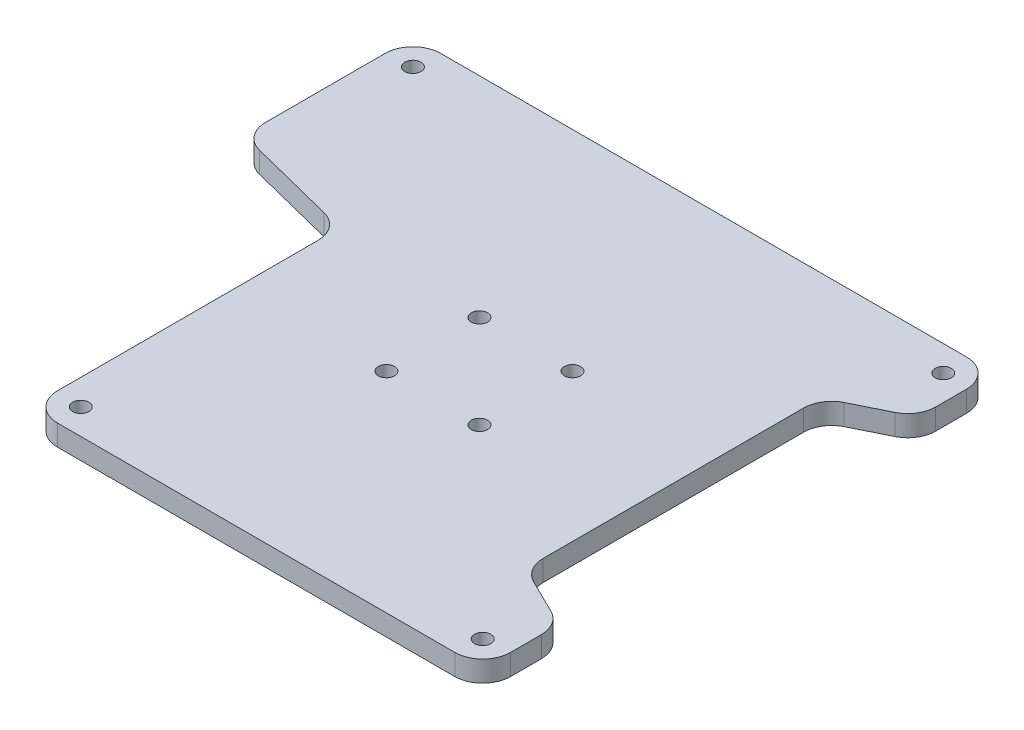
ISO-10303-21;
HEADER;
FILE_DESCRIPTION(('STEP AP214'),'2;1');
FILE_NAME('part.step','',(''),(''),'','','');
FILE_SCHEMA(('AUTOMOTIVE_DESIGN { 1 0 10303 214 1 1 1 1 }'));
ENDSEC;
DATA;
#1=APPLICATION_CONTEXT('core data for automotive mechanical design processes');
#2=APPLICATION_PROTOCOL_DEFINITION('international standard','automotive_design',2000,#1);
#3=PRODUCT_CONTEXT('',#1,'mechanical');
#4=PRODUCT('Part','Part','',(#3));
#5=PRODUCT_RELATED_PRODUCT_CATEGORY('part','',(#4));
#6=PRODUCT_DEFINITION_FORMATION('','',#4);
#7=PRODUCT_DEFINITION_CONTEXT('part definition',#1,'design');
#8=PRODUCT_DEFINITION('design','',#6,#7);
#9=PRODUCT_DEFINITION_SHAPE('','',#8);
#10=(LENGTH_UNIT() NAMED_UNIT(*) SI_UNIT(.MILLI.,.METRE.));
#11=(NAMED_UNIT(*) PLANE_ANGLE_UNIT() SI_UNIT($,.RADIAN.));
#12=(NAMED_UNIT(*) SI_UNIT($,.STERADIAN.) SOLID_ANGLE_UNIT());
#13=UNCERTAINTY_MEASURE_WITH_UNIT(LENGTH_MEASURE(1.E-05),#10,'distance_accuracy_value','');
#14=(GEOMETRIC_REPRESENTATION_CONTEXT(3) GLOBAL_UNCERTAINTY_ASSIGNED_CONTEXT((#13)) GLOBAL_UNIT_ASSIGNED_CONTEXT((#10,
#11,#12)) REPRESENTATION_CONTEXT('',''));
#15=CARTESIAN_POINT('',(0.,0.,0.));
#16=DIRECTION('',(0.,0.,1.));
#17=DIRECTION('',(1.,0.,0.));
#18=AXIS2_PLACEMENT_3D('',#15,#16,#17);
#19=CARTESIAN_POINT('',(-35.7,4.5,49.));
#20=DIRECTION('',(0.,1.,0.));
#21=DIRECTION('',(0.,0.,1.));
#22=AXIS2_PLACEMENT_3D('',#19,#20,#21);
#23=PLANE('',#22);
#24=CARTESIAN_POINT('',(10.,4.5,10.));
#25=DIRECTION('',(0.,1.,0.));
#26=DIRECTION('',(0.,0.,1.));
#27=AXIS2_PLACEMENT_3D('',#24,#25,#26);
#28=CIRCLE('',#27,1.75);
#29=CARTESIAN_POINT('',(10.,4.5,11.75));
#30=VERTEX_POINT('',#29);
#31=EDGE_CURVE('E478',#30,#30,#28,.T.);
#32=ORIENTED_EDGE('',*,*,#31,.F.);
#33=EDGE_LOOP('',(#32));
#34=FACE_BOUND('',#33,.T.);
#35=CARTESIAN_POINT('',(-10.,4.5,-10.));
#36=DIRECTION('',(0.,1.,0.));
#37=DIRECTION('',(0.,0.,1.));
#38=AXIS2_PLACEMENT_3D('',#35,#36,#37);
#39=CIRCLE('',#38,1.75);
#40=CARTESIAN_POINT('',(-10.,4.5,-8.25));
#41=VERTEX_POINT('',#40);
#42=EDGE_CURVE('E494',#41,#41,#39,.T.);
#43=ORIENTED_EDGE('',*,*,#42,.F.);
#44=EDGE_LOOP('',(#43));
#45=FACE_BOUND('',#44,.T.);
#46=CARTESIAN_POINT('',(-63.8,4.5,-49.5));
#47=DIRECTION('',(0.,1.,0.));
#48=DIRECTION('',(0.,0.,1.));
#49=AXIS2_PLACEMENT_3D('',#46,#47,#48);
#50=CIRCLE('',#49,1.75);
#51=CARTESIAN_POINT('',(-63.8,4.5,-47.75));
#52=VERTEX_POINT('',#51);
#53=EDGE_CURVE('E510',#52,#52,#50,.T.);
#54=ORIENTED_EDGE('',*,*,#53,.F.);
#55=EDGE_LOOP('',(#54));
#56=FACE_BOUND('',#55,.T.);
#57=CARTESIAN_POINT('',(-36.2,4.5,49.5));
#58=DIRECTION('',(0.,1.,0.));
#59=DIRECTION('',(0.,0.,1.));
#60=AXIS2_PLACEMENT_3D('',#57,#58,#59);
#61=CIRCLE('',#60,1.75);
#62=CARTESIAN_POINT('',(-36.2,4.5,51.25));
#63=VERTEX_POINT('',#62);
#64=EDGE_CURVE('E220',#63,#63,#61,.T.);
#65=ORIENTED_EDGE('',*,*,#64,.F.);
#66=EDGE_LOOP('',(#65));
#67=FACE_BOUND('',#66,.T.);
#68=CARTESIAN_POINT('',(-35.7,4.5,49.));
#69=DIRECTION('',(0.,1.,0.));
#70=DIRECTION('',(0.,0.,1.));
#71=AXIS2_PLACEMENT_3D('',#68,#69,#70);
#72=CIRCLE('',#71,6.00000000000001);
#73=CARTESIAN_POINT('',(-41.7,4.5,49.));
#74=VERTEX_POINT('',#73);
#75=CARTESIAN_POINT('',(-35.7,4.5,55.));
#76=VERTEX_POINT('',#75);
#77=EDGE_CURVE('E274',#74,#76,#72,.T.);
#78=ORIENTED_EDGE('',*,*,#77,.T.);
#79=DIRECTION('',(1.,0.,0.));
#80=VECTOR('',#79,1.);
#81=CARTESIAN_POINT('',(-35.7,4.5,55.));
#82=LINE('',#81,#80);
#83=CARTESIAN_POINT('',(49.7,4.5,55.));
#84=VERTEX_POINT('',#83);
#85=EDGE_CURVE('E138',#76,#84,#82,.T.);
#86=ORIENTED_EDGE('',*,*,#85,.T.);
#87=CARTESIAN_POINT('',(49.7,4.5,49.));
#88=DIRECTION('',(0.,1.,0.));
#89=DIRECTION('',(0.,0.,1.));
#90=AXIS2_PLACEMENT_3D('',#87,#88,#89);
#91=CIRCLE('',#90,5.99999999999999);
#92=CARTESIAN_POINT('',(55.7,4.5,49.));
#93=VERTEX_POINT('',#92);
#94=EDGE_CURVE('E343',#84,#93,#91,.T.);
#95=ORIENTED_EDGE('',*,*,#94,.T.);
#96=DIRECTION('',(0.,0.,-1.));
#97=VECTOR('',#96,1.);
#98=CARTESIAN_POINT('',(55.7,4.5,49.));
#99=LINE('',#98,#97);
#100=CARTESIAN_POINT('',(55.7,4.5,42.3778187247569));
#101=VERTEX_POINT('',#100);
#102=EDGE_CURVE('E363',#93,#101,#99,.T.);
#103=ORIENTED_EDGE('',*,*,#102,.T.);
#104=CARTESIAN_POINT('',(49.7,4.5,42.3778187247569));
#105=DIRECTION('',(0.,1.,0.));
#106=DIRECTION('',(0.,0.,1.));
#107=AXIS2_PLACEMENT_3D('',#104,#105,#106);
#108=CIRCLE('',#107,6.);
#109=CARTESIAN_POINT('',(52.3606513795788,4.5,37.));
#110=VERTEX_POINT('',#109);
#111=EDGE_CURVE('E359',#101,#110,#108,.T.);
#112=ORIENTED_EDGE('',*,*,#111,.T.);
#113=DIRECTION('',(-0.896303120792812,0.,-0.443441896596461));
#114=VECTOR('',#113,1.);
#115=CARTESIAN_POINT('',(52.3606513795788,4.5,37.));
#116=LINE('',#115,#114);
#117=CARTESIAN_POINT('',(45.0393486204213,4.5,33.3778187247569));
#118=VERTEX_POINT('',#117);
#119=EDGE_CURVE('E362',#110,#118,#116,.T.);
#120=ORIENTED_EDGE('',*,*,#119,.T.);
#121=CARTESIAN_POINT('',(47.7,4.5,28.));
#122=DIRECTION('',(0.,-1.,0.));
#123=DIRECTION('',(0.,0.,-1.));
#124=AXIS2_PLACEMENT_3D('',#121,#122,#123);
#125=CIRCLE('',#124,6.00000000000001);
#126=CARTESIAN_POINT('',(41.7,4.5,28.));
#127=VERTEX_POINT('',#126);
#128=EDGE_CURVE('E367',#118,#127,#125,.T.);
#129=ORIENTED_EDGE('',*,*,#128,.T.);
#130=DIRECTION('',(0.,0.,-1.));
#131=VECTOR('',#130,1.);
#132=CARTESIAN_POINT('',(41.7,4.5,28.));
#133=LINE('',#132,#131);
#134=CARTESIAN_POINT('',(41.7,4.5,-28.));
#135=VERTEX_POINT('',#134);
#136=EDGE_CURVE('E374',#127,#135,#133,.T.);
#137=ORIENTED_EDGE('',*,*,#136,.T.);
#138=CARTESIAN_POINT('',(47.7,4.5,-28.));
#139=DIRECTION('',(0.,-1.,0.));
#140=DIRECTION('',(0.,0.,-1.));
#141=AXIS2_PLACEMENT_3D('',#138,#139,#140);
#142=CIRCLE('',#141,6.);
#143=CARTESIAN_POINT('',(45.0393486204212,4.5,-33.3778187247569));
#144=VERTEX_POINT('',#143);
#145=EDGE_CURVE('E377',#135,#144,#142,.T.);
#146=ORIENTED_EDGE('',*,*,#145,.T.);
#147=DIRECTION('',(0.896303120792812,0.,-0.443441896596461));
#148=VECTOR('',#147,1.);
#149=CARTESIAN_POINT('',(45.0393486204213,4.5,-33.3778187247569));
#150=LINE('',#149,#148);
#151=CARTESIAN_POINT('',(52.3606513795788,4.5,-37.));
#152=VERTEX_POINT('',#151);
#153=EDGE_CURVE('E380',#144,#152,#150,.T.);
#154=ORIENTED_EDGE('',*,*,#153,.T.);
#155=CARTESIAN_POINT('',(49.7,4.5,-42.3778187247569));
#156=DIRECTION('',(0.,1.,0.));
#157=DIRECTION('',(0.,0.,1.));
#158=AXIS2_PLACEMENT_3D('',#155,#156,#157);
#159=CIRCLE('',#158,6.);
#160=CARTESIAN_POINT('',(55.7,4.5,-42.3778187247569));
#161=VERTEX_POINT('',#160);
#162=EDGE_CURVE('E383',#152,#161,#159,.T.);
#163=ORIENTED_EDGE('',*,*,#162,.T.);
#164=DIRECTION('',(0.,0.,-1.));
#165=VECTOR('',#164,1.);
#166=CARTESIAN_POINT('',(55.7,4.5,-42.3778187247569));
#167=LINE('',#166,#165);
#168=CARTESIAN_POINT('',(55.7,4.5,-49.));
#169=VERTEX_POINT('',#168);
#170=EDGE_CURVE('E386',#161,#169,#167,.T.);
#171=ORIENTED_EDGE('',*,*,#170,.T.);
#172=CARTESIAN_POINT('',(49.7,4.5,-49.));
#173=DIRECTION('',(0.,1.,0.));
#174=DIRECTION('',(0.,0.,1.));
#175=AXIS2_PLACEMENT_3D('',#172,#173,#174);
#176=CIRCLE('',#175,6.);
#177=CARTESIAN_POINT('',(49.7,4.5,-55.));
#178=VERTEX_POINT('',#177);
#179=EDGE_CURVE('E389',#169,#178,#176,.T.);
#180=ORIENTED_EDGE('',*,*,#179,.T.);
#181=DIRECTION('',(-1.,0.,0.));
#182=VECTOR('',#181,1.);
#183=CARTESIAN_POINT('',(49.7,4.5,-55.));
#184=LINE('',#183,#182);
#185=CARTESIAN_POINT('',(-63.3,4.5,-55.));
#186=VERTEX_POINT('',#185);
#187=EDGE_CURVE('E392',#178,#186,#184,.T.);
#188=ORIENTED_EDGE('',*,*,#187,.T.);
#189=CARTESIAN_POINT('',(-63.3,4.5,-49.));
#190=DIRECTION('',(0.,1.,0.));
#191=DIRECTION('',(0.,0.,1.));
#192=AXIS2_PLACEMENT_3D('',#189,#190,#191);
#193=CIRCLE('',#192,6.00000000000001);
#194=CARTESIAN_POINT('',(-69.3,4.5,-49.));
#195=VERTEX_POINT('',#194);
#196=EDGE_CURVE('E395',#186,#195,#193,.T.);
#197=ORIENTED_EDGE('',*,*,#196,.T.);
#198=DIRECTION('',(0.,0.,1.));
#199=VECTOR('',#198,1.);
#200=CARTESIAN_POINT('',(-69.3,4.5,-49.));
#201=LINE('',#200,#199);
#202=CARTESIAN_POINT('',(-69.3,4.5,-23.317292810075));
#203=VERTEX_POINT('',#202);
#204=EDGE_CURVE('E398',#195,#203,#201,.T.);
#205=ORIENTED_EDGE('',*,*,#204,.T.);
#206=CARTESIAN_POINT('',(-63.3,4.5,-23.317292810075));
#207=DIRECTION('',(0.,1.,0.));
#208=DIRECTION('',(0.,0.,1.));
#209=AXIS2_PLACEMENT_3D('',#206,#207,#208);
#210=CIRCLE('',#209,6.);
#211=CARTESIAN_POINT('',(-64.7693891117909,4.5,-17.5));
#212=VERTEX_POINT('',#211);
#213=EDGE_CURVE('E193',#203,#212,#210,.T.);
#214=ORIENTED_EDGE('',*,*,#213,.T.);
#215=DIRECTION('',(0.969548801679168,0.,0.244898185298482));
#216=VECTOR('',#215,1.);
#217=CARTESIAN_POINT('',(-64.7693891117909,4.5,-17.5));
#218=LINE('',#217,#216);
#219=CARTESIAN_POINT('',(-46.2306108882091,4.5,-12.817292810075));
#220=VERTEX_POINT('',#219);
#221=EDGE_CURVE('E187',#212,#220,#218,.T.);
#222=ORIENTED_EDGE('',*,*,#221,.T.);
#223=CARTESIAN_POINT('',(-47.7,4.5,-6.99999999999999));
#224=DIRECTION('',(0.,-1.,0.));
#225=DIRECTION('',(0.,0.,-1.));
#226=AXIS2_PLACEMENT_3D('',#223,#224,#225);
#227=CIRCLE('',#226,6.);
#228=CARTESIAN_POINT('',(-41.7,4.5,-6.99999999999999));
#229=VERTEX_POINT('',#228);
#230=EDGE_CURVE('E191',#220,#229,#227,.T.);
#231=ORIENTED_EDGE('',*,*,#230,.T.);
#232=DIRECTION('',(0.,0.,1.));
#233=VECTOR('',#232,1.);
#234=CARTESIAN_POINT('',(-41.7,4.5,-6.99999999999999));
#235=LINE('',#234,#233);
#236=EDGE_CURVE('E59',#229,#74,#235,.T.);
#237=ORIENTED_EDGE('',*,*,#236,.T.);
#238=EDGE_LOOP('',(#78,#86,#95,#103,#112,#120,#129,#137,#146,#154,#163,#171,#180,#188,#197,#205,
#214,#222,#231,#237));
#239=FACE_BOUND('',#238,.T.);
#240=CARTESIAN_POINT('',(50.2,4.5,49.5));
#241=DIRECTION('',(0.,1.,0.));
#242=DIRECTION('',(0.,0.,1.));
#243=AXIS2_PLACEMENT_3D('',#240,#241,#242);
#244=CIRCLE('',#243,1.75);
#245=CARTESIAN_POINT('',(50.2,4.5,51.25));
#246=VERTEX_POINT('',#245);
#247=EDGE_CURVE('E518',#246,#246,#244,.T.);
#248=ORIENTED_EDGE('',*,*,#247,.F.);
#249=EDGE_LOOP('',(#248));
#250=FACE_BOUND('',#249,.T.);
#251=CARTESIAN_POINT('',(50.2,4.5,-49.5));
#252=DIRECTION('',(0.,1.,0.));
#253=DIRECTION('',(0.,0.,1.));
#254=AXIS2_PLACEMENT_3D('',#251,#252,#253);
#255=CIRCLE('',#254,1.75);
#256=CARTESIAN_POINT('',(50.2,4.5,-47.75));
#257=VERTEX_POINT('',#256);
#258=EDGE_CURVE('E502',#257,#257,#255,.T.);
#259=ORIENTED_EDGE('',*,*,#258,.F.);
#260=EDGE_LOOP('',(#259));
#261=FACE_BOUND('',#260,.T.);
#262=CARTESIAN_POINT('',(-10.,4.5,10.));
#263=DIRECTION('',(0.,1.,0.));
#264=DIRECTION('',(0.,0.,1.));
#265=AXIS2_PLACEMENT_3D('',#262,#263,#264);
#266=CIRCLE('',#265,1.75);
#267=CARTESIAN_POINT('',(-10.,4.5,11.75));
#268=VERTEX_POINT('',#267);
#269=EDGE_CURVE('E486',#268,#268,#266,.T.);
#270=ORIENTED_EDGE('',*,*,#269,.F.);
#271=EDGE_LOOP('',(#270));
#272=FACE_BOUND('',#271,.T.);
#273=CARTESIAN_POINT('',(10.,4.5,-10.));
#274=DIRECTION('',(0.,1.,0.));
#275=DIRECTION('',(0.,0.,1.));
#276=AXIS2_PLACEMENT_3D('',#273,#274,#275);
#277=CIRCLE('',#276,1.75);
#278=CARTESIAN_POINT('',(10.,4.5,-8.25));
#279=VERTEX_POINT('',#278);
#280=EDGE_CURVE('E467',#279,#279,#277,.T.);
#281=ORIENTED_EDGE('',*,*,#280,.F.);
#282=EDGE_LOOP('',(#281));
#283=FACE_BOUND('',#282,.T.);
#284=ADVANCED_FACE('F41',(#34,#45,#56,#67,#239,#250,#261,#272,#283),#23,.T.);
#285=CARTESIAN_POINT('',(-35.7,0.,49.));
#286=DIRECTION('',(0.,1.,0.));
#287=DIRECTION('',(0.,0.,1.));
#288=AXIS2_PLACEMENT_3D('',#285,#286,#287);
#289=PLANE('',#288);
#290=CARTESIAN_POINT('',(-35.7,0.,49.));
#291=DIRECTION('',(0.,1.,0.));
#292=DIRECTION('',(0.,0.,1.));
#293=AXIS2_PLACEMENT_3D('',#290,#291,#292);
#294=CIRCLE('',#293,6.00000000000001);
#295=CARTESIAN_POINT('',(-41.7,0.,49.));
#296=VERTEX_POINT('',#295);
#297=CARTESIAN_POINT('',(-35.7,0.,55.));
#298=VERTEX_POINT('',#297);
#299=EDGE_CURVE('E215',#296,#298,#294,.T.);
#300=ORIENTED_EDGE('',*,*,#299,.F.);
#301=DIRECTION('',(0.,0.,1.));
#302=VECTOR('',#301,1.);
#303=CARTESIAN_POINT('',(-41.7,0.,-6.99999999999999));
#304=LINE('',#303,#302);
#305=CARTESIAN_POINT('',(-41.7,0.,-6.99999999999999));
#306=VERTEX_POINT('',#305);
#307=EDGE_CURVE('E130',#306,#296,#304,.T.);
#308=ORIENTED_EDGE('',*,*,#307,.F.);
#309=CARTESIAN_POINT('',(-47.7,0.,-6.99999999999999));
#310=DIRECTION('',(0.,-1.,0.));
#311=DIRECTION('',(0.,0.,-1.));
#312=AXIS2_PLACEMENT_3D('',#309,#310,#311);
#313=CIRCLE('',#312,6.);
#314=CARTESIAN_POINT('',(-46.2306108882091,0.,-12.817292810075));
#315=VERTEX_POINT('',#314);
#316=EDGE_CURVE('E124',#315,#306,#313,.T.);
#317=ORIENTED_EDGE('',*,*,#316,.F.);
#318=DIRECTION('',(0.969548801679168,0.,0.244898185298482));
#319=VECTOR('',#318,1.);
#320=CARTESIAN_POINT('',(-64.7693891117909,0.,-17.5));
#321=LINE('',#320,#319);
#322=CARTESIAN_POINT('',(-64.7693891117909,0.,-17.5));
#323=VERTEX_POINT('',#322);
#324=EDGE_CURVE('E202',#323,#315,#321,.T.);
#325=ORIENTED_EDGE('',*,*,#324,.F.);
#326=CARTESIAN_POINT('',(-63.3,0.,-23.317292810075));
#327=DIRECTION('',(0.,1.,0.));
#328=DIRECTION('',(0.,0.,1.));
#329=AXIS2_PLACEMENT_3D('',#326,#327,#328);
#330=CIRCLE('',#329,6.);
#331=CARTESIAN_POINT('',(-69.3,0.,-23.317292810075));
#332=VERTEX_POINT('',#331);
#333=EDGE_CURVE('E265',#332,#323,#330,.T.);
#334=ORIENTED_EDGE('',*,*,#333,.F.);
#335=DIRECTION('',(0.,0.,1.));
#336=VECTOR('',#335,1.);
#337=CARTESIAN_POINT('',(-69.3,0.,-49.));
#338=LINE('',#337,#336);
#339=CARTESIAN_POINT('',(-69.3,0.,-49.));
#340=VERTEX_POINT('',#339);
#341=EDGE_CURVE('E262',#340,#332,#338,.T.);
#342=ORIENTED_EDGE('',*,*,#341,.F.);
#343=CARTESIAN_POINT('',(-63.3,0.,-49.));
#344=DIRECTION('',(0.,1.,0.));
#345=DIRECTION('',(0.,0.,1.));
#346=AXIS2_PLACEMENT_3D('',#343,#344,#345);
#347=CIRCLE('',#346,6.00000000000001);
#348=CARTESIAN_POINT('',(-63.3,0.,-55.));
#349=VERTEX_POINT('',#348);
#350=EDGE_CURVE('E259',#349,#340,#347,.T.);
#351=ORIENTED_EDGE('',*,*,#350,.F.);
#352=DIRECTION('',(-1.,0.,0.));
#353=VECTOR('',#352,1.);
#354=CARTESIAN_POINT('',(49.7,0.,-55.));
#355=LINE('',#354,#353);
#356=CARTESIAN_POINT('',(49.7,0.,-55.));
#357=VERTEX_POINT('',#356);
#358=EDGE_CURVE('E256',#357,#349,#355,.T.);
#359=ORIENTED_EDGE('',*,*,#358,.F.);
#360=CARTESIAN_POINT('',(49.7,0.,-49.));
#361=DIRECTION('',(0.,1.,0.));
#362=DIRECTION('',(0.,0.,1.));
#363=AXIS2_PLACEMENT_3D('',#360,#361,#362);
#364=CIRCLE('',#363,6.);
#365=CARTESIAN_POINT('',(55.7,0.,-49.));
#366=VERTEX_POINT('',#365);
#367=EDGE_CURVE('E253',#366,#357,#364,.T.);
#368=ORIENTED_EDGE('',*,*,#367,.F.);
#369=DIRECTION('',(0.,0.,-1.));
#370=VECTOR('',#369,1.);
#371=CARTESIAN_POINT('',(55.7,0.,-42.3778187247569));
#372=LINE('',#371,#370);
#373=CARTESIAN_POINT('',(55.7,0.,-42.3778187247569));
#374=VERTEX_POINT('',#373);
#375=EDGE_CURVE('E250',#374,#366,#372,.T.);
#376=ORIENTED_EDGE('',*,*,#375,.F.);
#377=CARTESIAN_POINT('',(49.7,0.,-42.3778187247569));
#378=DIRECTION('',(0.,1.,0.));
#379=DIRECTION('',(0.,0.,1.));
#380=AXIS2_PLACEMENT_3D('',#377,#378,#379);
#381=CIRCLE('',#380,6.);
#382=CARTESIAN_POINT('',(52.3606513795788,0.,-37.));
#383=VERTEX_POINT('',#382);
#384=EDGE_CURVE('E247',#383,#374,#381,.T.);
#385=ORIENTED_EDGE('',*,*,#384,.F.);
#386=DIRECTION('',(0.896303120792812,0.,-0.443441896596461));
#387=VECTOR('',#386,1.);
#388=CARTESIAN_POINT('',(45.0393486204213,0.,-33.3778187247569));
#389=LINE('',#388,#387);
#390=CARTESIAN_POINT('',(45.0393486204212,0.,-33.3778187247569));
#391=VERTEX_POINT('',#390);
#392=EDGE_CURVE('E244',#391,#383,#389,.T.);
#393=ORIENTED_EDGE('',*,*,#392,.F.);
#394=CARTESIAN_POINT('',(47.7,0.,-28.));
#395=DIRECTION('',(0.,-1.,0.));
#396=DIRECTION('',(0.,0.,-1.));
#397=AXIS2_PLACEMENT_3D('',#394,#395,#396);
#398=CIRCLE('',#397,6.);
#399=CARTESIAN_POINT('',(41.7,0.,-28.));
#400=VERTEX_POINT('',#399);
#401=EDGE_CURVE('E241',#400,#391,#398,.T.);
#402=ORIENTED_EDGE('',*,*,#401,.F.);
#403=DIRECTION('',(0.,0.,-1.));
#404=VECTOR('',#403,1.);
#405=CARTESIAN_POINT('',(41.7,0.,28.));
#406=LINE('',#405,#404);
#407=CARTESIAN_POINT('',(41.7,0.,28.));
#408=VERTEX_POINT('',#407);
#409=EDGE_CURVE('E238',#408,#400,#406,.T.);
#410=ORIENTED_EDGE('',*,*,#409,.F.);
#411=CARTESIAN_POINT('',(47.7,0.,28.));
#412=DIRECTION('',(0.,-1.,0.));
#413=DIRECTION('',(0.,0.,-1.));
#414=AXIS2_PLACEMENT_3D('',#411,#412,#413);
#415=CIRCLE('',#414,6.00000000000001);
#416=CARTESIAN_POINT('',(45.0393486204213,0.,33.3778187247569));
#417=VERTEX_POINT('',#416);
#418=EDGE_CURVE('E235',#417,#408,#415,.T.);
#419=ORIENTED_EDGE('',*,*,#418,.F.);
#420=DIRECTION('',(-0.896303120792812,0.,-0.443441896596461));
#421=VECTOR('',#420,1.);
#422=CARTESIAN_POINT('',(52.3606513795788,0.,37.));
#423=LINE('',#422,#421);
#424=CARTESIAN_POINT('',(52.3606513795788,0.,37.));
#425=VERTEX_POINT('',#424);
#426=EDGE_CURVE('E232',#425,#417,#423,.T.);
#427=ORIENTED_EDGE('',*,*,#426,.F.);
#428=CARTESIAN_POINT('',(49.7,0.,42.3778187247569));
#429=DIRECTION('',(0.,1.,0.));
#430=DIRECTION('',(0.,0.,1.));
#431=AXIS2_PLACEMENT_3D('',#428,#429,#430);
#432=CIRCLE('',#431,6.);
#433=CARTESIAN_POINT('',(55.7,0.,42.3778187247569));
#434=VERTEX_POINT('',#433);
#435=EDGE_CURVE('E229',#434,#425,#432,.T.);
#436=ORIENTED_EDGE('',*,*,#435,.F.);
#437=DIRECTION('',(0.,0.,-1.));
#438=VECTOR('',#437,1.);
#439=CARTESIAN_POINT('',(55.7,0.,49.));
#440=LINE('',#439,#438);
#441=CARTESIAN_POINT('',(55.7,0.,49.));
#442=VERTEX_POINT('',#441);
#443=EDGE_CURVE('E226',#442,#434,#440,.T.);
#444=ORIENTED_EDGE('',*,*,#443,.F.);
#445=CARTESIAN_POINT('',(49.7,0.,49.));
#446=DIRECTION('',(0.,1.,0.));
#447=DIRECTION('',(0.,0.,1.));
#448=AXIS2_PLACEMENT_3D('',#445,#446,#447);
#449=CIRCLE('',#448,5.99999999999999);
#450=CARTESIAN_POINT('',(49.7,0.,55.));
#451=VERTEX_POINT('',#450);
#452=EDGE_CURVE('E223',#451,#442,#449,.T.);
#453=ORIENTED_EDGE('',*,*,#452,.F.);
#454=DIRECTION('',(1.,0.,0.));
#455=VECTOR('',#454,1.);
#456=CARTESIAN_POINT('',(-35.7,0.,55.));
#457=LINE('',#456,#455);
#458=EDGE_CURVE('E219',#298,#451,#457,.T.);
#459=ORIENTED_EDGE('',*,*,#458,.F.);
#460=EDGE_LOOP('',(#300,#308,#317,#325,#334,#342,#351,#359,#368,#376,#385,#393,#402,#410,#419,
#427,#436,#444,#453,#459));
#461=FACE_BOUND('',#460,.T.);
#462=CARTESIAN_POINT('',(-36.2,0.,49.5));
#463=DIRECTION('',(0.,1.,0.));
#464=DIRECTION('',(0.,0.,1.));
#465=AXIS2_PLACEMENT_3D('',#462,#463,#464);
#466=CIRCLE('',#465,1.75);
#467=CARTESIAN_POINT('',(-36.2,0.,51.25));
#468=VERTEX_POINT('',#467);
#469=EDGE_CURVE('E522',#468,#468,#466,.T.);
#470=ORIENTED_EDGE('',*,*,#469,.T.);
#471=EDGE_LOOP('',(#470));
#472=FACE_BOUND('',#471,.T.);
#473=CARTESIAN_POINT('',(50.2,0.,49.5));
#474=DIRECTION('',(0.,1.,0.));
#475=DIRECTION('',(0.,0.,1.));
#476=AXIS2_PLACEMENT_3D('',#473,#474,#475);
#477=CIRCLE('',#476,1.75);
#478=CARTESIAN_POINT('',(50.2,0.,51.25));
#479=VERTEX_POINT('',#478);
#480=EDGE_CURVE('E514',#479,#479,#477,.T.);
#481=ORIENTED_EDGE('',*,*,#480,.T.);
#482=EDGE_LOOP('',(#481));
#483=FACE_BOUND('',#482,.T.);
#484=CARTESIAN_POINT('',(-63.8,0.,-49.5));
#485=DIRECTION('',(0.,1.,0.));
#486=DIRECTION('',(0.,0.,1.));
#487=AXIS2_PLACEMENT_3D('',#484,#485,#486);
#488=CIRCLE('',#487,1.75);
#489=CARTESIAN_POINT('',(-63.8,0.,-47.75));
#490=VERTEX_POINT('',#489);
#491=EDGE_CURVE('E506',#490,#490,#488,.T.);
#492=ORIENTED_EDGE('',*,*,#491,.T.);
#493=EDGE_LOOP('',(#492));
#494=FACE_BOUND('',#493,.T.);
#495=CARTESIAN_POINT('',(50.2,0.,-49.5));
#496=DIRECTION('',(0.,1.,0.));
#497=DIRECTION('',(0.,0.,1.));
#498=AXIS2_PLACEMENT_3D('',#495,#496,#497);
#499=CIRCLE('',#498,1.75);
#500=CARTESIAN_POINT('',(50.2,0.,-47.75));
#501=VERTEX_POINT('',#500);
#502=EDGE_CURVE('E498',#501,#501,#499,.T.);
#503=ORIENTED_EDGE('',*,*,#502,.T.);
#504=EDGE_LOOP('',(#503));
#505=FACE_BOUND('',#504,.T.);
#506=CARTESIAN_POINT('',(-10.,0.,-10.));
#507=DIRECTION('',(0.,1.,0.));
#508=DIRECTION('',(0.,0.,1.));
#509=AXIS2_PLACEMENT_3D('',#506,#507,#508);
#510=CIRCLE('',#509,1.75);
#511=CARTESIAN_POINT('',(-10.,0.,-8.25));
#512=VERTEX_POINT('',#511);
#513=EDGE_CURVE('E490',#512,#512,#510,.T.);
#514=ORIENTED_EDGE('',*,*,#513,.T.);
#515=EDGE_LOOP('',(#514));
#516=FACE_BOUND('',#515,.T.);
#517=CARTESIAN_POINT('',(-10.,0.,10.));
#518=DIRECTION('',(0.,1.,0.));
#519=DIRECTION('',(0.,0.,1.));
#520=AXIS2_PLACEMENT_3D('',#517,#518,#519);
#521=CIRCLE('',#520,1.75);
#522=CARTESIAN_POINT('',(-10.,0.,11.75));
#523=VERTEX_POINT('',#522);
#524=EDGE_CURVE('E482',#523,#523,#521,.T.);
#525=ORIENTED_EDGE('',*,*,#524,.T.);
#526=EDGE_LOOP('',(#525));
#527=FACE_BOUND('',#526,.T.);
#528=CARTESIAN_POINT('',(10.,0.,10.));
#529=DIRECTION('',(0.,1.,0.));
#530=DIRECTION('',(0.,0.,1.));
#531=AXIS2_PLACEMENT_3D('',#528,#529,#530);
#532=CIRCLE('',#531,1.75);
#533=CARTESIAN_POINT('',(10.,0.,11.75));
#534=VERTEX_POINT('',#533);
#535=EDGE_CURVE('E475',#534,#534,#532,.T.);
#536=ORIENTED_EDGE('',*,*,#535,.T.);
#537=EDGE_LOOP('',(#536));
#538=FACE_BOUND('',#537,.T.);
#539=CARTESIAN_POINT('',(10.,0.,-10.));
#540=DIRECTION('',(0.,1.,0.));
#541=DIRECTION('',(0.,0.,1.));
#542=AXIS2_PLACEMENT_3D('',#539,#540,#541);
#543=CIRCLE('',#542,1.75);
#544=CARTESIAN_POINT('',(10.,0.,-8.25));
#545=VERTEX_POINT('',#544);
#546=EDGE_CURVE('E470',#545,#545,#543,.T.);
#547=ORIENTED_EDGE('',*,*,#546,.T.);
#548=EDGE_LOOP('',(#547));
#549=FACE_BOUND('',#548,.T.);
#550=ADVANCED_FACE('F347',(#461,#472,#483,#494,#505,#516,#527,#538,#549),#289,.F.);
#551=CARTESIAN_POINT('',(-35.7,4.5,49.));
#552=DIRECTION('',(0.,-1.,0.));
#553=DIRECTION('',(0.,0.,-1.));
#554=AXIS2_PLACEMENT_3D('',#551,#552,#553);
#555=CYLINDRICAL_SURFACE('',#554,6.00000000000001);
#556=ORIENTED_EDGE('',*,*,#299,.T.);
#557=DIRECTION('',(0.,-1.,0.));
#558=VECTOR('',#557,1.);
#559=CARTESIAN_POINT('',(-35.7,4.5,55.));
#560=LINE('',#559,#558);
#561=EDGE_CURVE('E11',#76,#298,#560,.T.);
#562=ORIENTED_EDGE('',*,*,#561,.F.);
#563=ORIENTED_EDGE('',*,*,#77,.F.);
#564=DIRECTION('',(0.,-1.,0.));
#565=VECTOR('',#564,1.);
#566=CARTESIAN_POINT('',(-41.7,4.5,49.));
#567=LINE('',#566,#565);
#568=EDGE_CURVE('E211',#74,#296,#567,.T.);
#569=ORIENTED_EDGE('',*,*,#568,.T.);
#570=EDGE_LOOP('',(#556,#562,#563,#569));
#571=FACE_BOUND('',#570,.T.);
#572=ADVANCED_FACE('F43',(#571),#555,.T.);
#573=CARTESIAN_POINT('',(-35.7,4.5,55.));
#574=DIRECTION('',(0.,0.,-1.));
#575=DIRECTION('',(-1.,0.,0.));
#576=AXIS2_PLACEMENT_3D('',#573,#574,#575);
#577=PLANE('',#576);
#578=ORIENTED_EDGE('',*,*,#458,.T.);
#579=DIRECTION('',(0.,-1.,0.));
#580=VECTOR('',#579,1.);
#581=CARTESIAN_POINT('',(49.7,4.5,55.));
#582=LINE('',#581,#580);
#583=EDGE_CURVE('E51',#84,#451,#582,.T.);
#584=ORIENTED_EDGE('',*,*,#583,.F.);
#585=ORIENTED_EDGE('',*,*,#85,.F.);
#586=ORIENTED_EDGE('',*,*,#561,.T.);
#587=EDGE_LOOP('',(#578,#584,#585,#586));
#588=FACE_BOUND('',#587,.T.);
#589=ADVANCED_FACE('F754',(#588),#577,.F.);
#590=CARTESIAN_POINT('',(49.7,4.5,49.));
#591=DIRECTION('',(0.,-1.,0.));
#592=DIRECTION('',(0.,0.,-1.));
#593=AXIS2_PLACEMENT_3D('',#590,#591,#592);
#594=CYLINDRICAL_SURFACE('',#593,5.99999999999999);
#595=ORIENTED_EDGE('',*,*,#452,.T.);
#596=DIRECTION('',(0.,-1.,0.));
#597=VECTOR('',#596,1.);
#598=CARTESIAN_POINT('',(55.7,4.5,49.));
#599=LINE('',#598,#597);
#600=EDGE_CURVE('E333',#93,#442,#599,.T.);
#601=ORIENTED_EDGE('',*,*,#600,.F.);
#602=ORIENTED_EDGE('',*,*,#94,.F.);
#603=ORIENTED_EDGE('',*,*,#583,.T.);
#604=EDGE_LOOP('',(#595,#601,#602,#603));
#605=FACE_BOUND('',#604,.T.);
#606=ADVANCED_FACE('F341',(#605),#594,.T.);
#607=CARTESIAN_POINT('',(55.7,4.5,49.));
#608=DIRECTION('',(-1.,0.,0.));
#609=DIRECTION('',(0.,0.,1.));
#610=AXIS2_PLACEMENT_3D('',#607,#608,#609);
#611=PLANE('',#610);
#612=ORIENTED_EDGE('',*,*,#443,.T.);
#613=DIRECTION('',(0.,-1.,0.));
#614=VECTOR('',#613,1.);
#615=CARTESIAN_POINT('',(55.7,4.5,42.3778187247569));
#616=LINE('',#615,#614);
#617=EDGE_CURVE('E329',#101,#434,#616,.T.);
#618=ORIENTED_EDGE('',*,*,#617,.F.);
#619=ORIENTED_EDGE('',*,*,#102,.F.);
#620=ORIENTED_EDGE('',*,*,#600,.T.);
#621=EDGE_LOOP('',(#612,#618,#619,#620));
#622=FACE_BOUND('',#621,.T.);
#623=ADVANCED_FACE('F353',(#622),#611,.F.);
#624=CARTESIAN_POINT('',(49.7,4.5,42.3778187247569));
#625=DIRECTION('',(0.,-1.,0.));
#626=DIRECTION('',(0.,0.,-1.));
#627=AXIS2_PLACEMENT_3D('',#624,#625,#626);
#628=CYLINDRICAL_SURFACE('',#627,6.);
#629=ORIENTED_EDGE('',*,*,#435,.T.);
#630=DIRECTION('',(0.,-1.,0.));
#631=VECTOR('',#630,1.);
#632=CARTESIAN_POINT('',(52.3606513795788,4.5,37.));
#633=LINE('',#632,#631);
#634=EDGE_CURVE('E325',#110,#425,#633,.T.);
#635=ORIENTED_EDGE('',*,*,#634,.F.);
#636=ORIENTED_EDGE('',*,*,#111,.F.);
#637=ORIENTED_EDGE('',*,*,#617,.T.);
#638=EDGE_LOOP('',(#629,#635,#636,#637));
#639=FACE_BOUND('',#638,.T.);
#640=ADVANCED_FACE('F357',(#639),#628,.T.);
#641=CARTESIAN_POINT('',(52.3606513795788,4.5,37.));
#642=DIRECTION('',(-0.443441896596461,0.,0.896303120792812));
#643=DIRECTION('',(0.896303120792812,0.,0.443441896596461));
#644=AXIS2_PLACEMENT_3D('',#641,#642,#643);
#645=PLANE('',#644);
#646=ORIENTED_EDGE('',*,*,#426,.T.);
#647=DIRECTION('',(0.,-1.,0.));
#648=VECTOR('',#647,1.);
#649=CARTESIAN_POINT('',(45.0393486204213,4.5,33.3778187247569));
#650=LINE('',#649,#648);
#651=EDGE_CURVE('E321',#118,#417,#650,.T.);
#652=ORIENTED_EDGE('',*,*,#651,.F.);
#653=ORIENTED_EDGE('',*,*,#119,.F.);
#654=ORIENTED_EDGE('',*,*,#634,.T.);
#655=EDGE_LOOP('',(#646,#652,#653,#654));
#656=FACE_BOUND('',#655,.T.);
#657=ADVANCED_FACE('F719',(#656),#645,.F.);
#658=CARTESIAN_POINT('',(47.7,4.5,28.));
#659=DIRECTION('',(0.,-1.,0.));
#660=DIRECTION('',(0.,0.,-1.));
#661=AXIS2_PLACEMENT_3D('',#658,#659,#660);
#662=CYLINDRICAL_SURFACE('',#661,6.00000000000001);
#663=ORIENTED_EDGE('',*,*,#418,.T.);
#664=DIRECTION('',(0.,-1.,0.));
#665=VECTOR('',#664,1.);
#666=CARTESIAN_POINT('',(41.7,4.5,28.));
#667=LINE('',#666,#665);
#668=EDGE_CURVE('E317',#127,#408,#667,.T.);
#669=ORIENTED_EDGE('',*,*,#668,.F.);
#670=ORIENTED_EDGE('',*,*,#128,.F.);
#671=ORIENTED_EDGE('',*,*,#651,.T.);
#672=EDGE_LOOP('',(#663,#669,#670,#671));
#673=FACE_BOUND('',#672,.T.);
#674=ADVANCED_FACE('F709',(#673),#662,.F.);
#675=CARTESIAN_POINT('',(41.7,4.5,28.));
#676=DIRECTION('',(-1.,0.,0.));
#677=DIRECTION('',(0.,0.,1.));
#678=AXIS2_PLACEMENT_3D('',#675,#676,#677);
#679=PLANE('',#678);
#680=ORIENTED_EDGE('',*,*,#409,.T.);
#681=DIRECTION('',(0.,-1.,0.));
#682=VECTOR('',#681,1.);
#683=CARTESIAN_POINT('',(41.7,4.5,-28.));
#684=LINE('',#683,#682);
#685=EDGE_CURVE('E313',#135,#400,#684,.T.);
#686=ORIENTED_EDGE('',*,*,#685,.F.);
#687=ORIENTED_EDGE('',*,*,#136,.F.);
#688=ORIENTED_EDGE('',*,*,#668,.T.);
#689=EDGE_LOOP('',(#680,#686,#687,#688));
#690=FACE_BOUND('',#689,.T.);
#691=ADVANCED_FACE('F699',(#690),#679,.F.);
#692=CARTESIAN_POINT('',(47.7,4.5,-28.));
#693=DIRECTION('',(0.,-1.,0.));
#694=DIRECTION('',(0.,0.,-1.));
#695=AXIS2_PLACEMENT_3D('',#692,#693,#694);
#696=CYLINDRICAL_SURFACE('',#695,6.);
#697=ORIENTED_EDGE('',*,*,#401,.T.);
#698=DIRECTION('',(0.,-1.,0.));
#699=VECTOR('',#698,1.);
#700=CARTESIAN_POINT('',(45.0393486204212,4.5,-33.3778187247569));
#701=LINE('',#700,#699);
#702=EDGE_CURVE('E309',#144,#391,#701,.T.);
#703=ORIENTED_EDGE('',*,*,#702,.F.);
#704=ORIENTED_EDGE('',*,*,#145,.F.);
#705=ORIENTED_EDGE('',*,*,#685,.T.);
#706=EDGE_LOOP('',(#697,#703,#704,#705));
#707=FACE_BOUND('',#706,.T.);
#708=ADVANCED_FACE('F689',(#707),#696,.F.);
#709=CARTESIAN_POINT('',(45.0393486204213,4.5,-33.3778187247569));
#710=DIRECTION('',(-0.443441896596461,0.,-0.896303120792812));
#711=DIRECTION('',(-0.896303120792812,0.,0.443441896596461));
#712=AXIS2_PLACEMENT_3D('',#709,#710,#711);
#713=PLANE('',#712);
#714=ORIENTED_EDGE('',*,*,#392,.T.);
#715=DIRECTION('',(0.,-1.,0.));
#716=VECTOR('',#715,1.);
#717=CARTESIAN_POINT('',(52.3606513795788,4.5,-37.));
#718=LINE('',#717,#716);
#719=EDGE_CURVE('E305',#152,#383,#718,.T.);
#720=ORIENTED_EDGE('',*,*,#719,.F.);
#721=ORIENTED_EDGE('',*,*,#153,.F.);
#722=ORIENTED_EDGE('',*,*,#702,.T.);
#723=EDGE_LOOP('',(#714,#720,#721,#722));
#724=FACE_BOUND('',#723,.T.);
#725=ADVANCED_FACE('F679',(#724),#713,.F.);
#726=CARTESIAN_POINT('',(49.7,4.5,-42.3778187247569));
#727=DIRECTION('',(0.,-1.,0.));
#728=DIRECTION('',(0.,0.,-1.));
#729=AXIS2_PLACEMENT_3D('',#726,#727,#728);
#730=CYLINDRICAL_SURFACE('',#729,6.);
#731=ORIENTED_EDGE('',*,*,#384,.T.);
#732=DIRECTION('',(0.,-1.,0.));
#733=VECTOR('',#732,1.);
#734=CARTESIAN_POINT('',(55.7,4.5,-42.3778187247569));
#735=LINE('',#734,#733);
#736=EDGE_CURVE('E301',#161,#374,#735,.T.);
#737=ORIENTED_EDGE('',*,*,#736,.F.);
#738=ORIENTED_EDGE('',*,*,#162,.F.);
#739=ORIENTED_EDGE('',*,*,#719,.T.);
#740=EDGE_LOOP('',(#731,#737,#738,#739));
#741=FACE_BOUND('',#740,.T.);
#742=ADVANCED_FACE('F669',(#741),#730,.T.);
#743=CARTESIAN_POINT('',(55.7,4.5,-42.3778187247569));
#744=DIRECTION('',(-1.,0.,0.));
#745=DIRECTION('',(0.,0.,1.));
#746=AXIS2_PLACEMENT_3D('',#743,#744,#745);
#747=PLANE('',#746);
#748=ORIENTED_EDGE('',*,*,#375,.T.);
#749=DIRECTION('',(0.,-1.,0.));
#750=VECTOR('',#749,1.);
#751=CARTESIAN_POINT('',(55.7,4.5,-49.));
#752=LINE('',#751,#750);
#753=EDGE_CURVE('E297',#169,#366,#752,.T.);
#754=ORIENTED_EDGE('',*,*,#753,.F.);
#755=ORIENTED_EDGE('',*,*,#170,.F.);
#756=ORIENTED_EDGE('',*,*,#736,.T.);
#757=EDGE_LOOP('',(#748,#754,#755,#756));
#758=FACE_BOUND('',#757,.T.);
#759=ADVANCED_FACE('F659',(#758),#747,.F.);
#760=CARTESIAN_POINT('',(49.7,4.5,-49.));
#761=DIRECTION('',(0.,-1.,0.));
#762=DIRECTION('',(0.,0.,-1.));
#763=AXIS2_PLACEMENT_3D('',#760,#761,#762);
#764=CYLINDRICAL_SURFACE('',#763,6.);
#765=ORIENTED_EDGE('',*,*,#367,.T.);
#766=DIRECTION('',(0.,-1.,0.));
#767=VECTOR('',#766,1.);
#768=CARTESIAN_POINT('',(49.7,4.5,-55.));
#769=LINE('',#768,#767);
#770=EDGE_CURVE('E293',#178,#357,#769,.T.);
#771=ORIENTED_EDGE('',*,*,#770,.F.);
#772=ORIENTED_EDGE('',*,*,#179,.F.);
#773=ORIENTED_EDGE('',*,*,#753,.T.);
#774=EDGE_LOOP('',(#765,#771,#772,#773));
#775=FACE_BOUND('',#774,.T.);
#776=ADVANCED_FACE('F649',(#775),#764,.T.);
#777=CARTESIAN_POINT('',(49.7,4.5,-55.));
#778=DIRECTION('',(0.,0.,1.));
#779=DIRECTION('',(1.,0.,0.));
#780=AXIS2_PLACEMENT_3D('',#777,#778,#779);
#781=PLANE('',#780);
#782=ORIENTED_EDGE('',*,*,#358,.T.);
#783=DIRECTION('',(0.,-1.,0.));
#784=VECTOR('',#783,1.);
#785=CARTESIAN_POINT('',(-63.3,4.5,-55.));
#786=LINE('',#785,#784);
#787=EDGE_CURVE('E289',#186,#349,#786,.T.);
#788=ORIENTED_EDGE('',*,*,#787,.F.);
#789=ORIENTED_EDGE('',*,*,#187,.F.);
#790=ORIENTED_EDGE('',*,*,#770,.T.);
#791=EDGE_LOOP('',(#782,#788,#789,#790));
#792=FACE_BOUND('',#791,.T.);
#793=ADVANCED_FACE('F639',(#792),#781,.F.);
#794=CARTESIAN_POINT('',(-63.3,4.5,-49.));
#795=DIRECTION('',(0.,-1.,0.));
#796=DIRECTION('',(0.,0.,-1.));
#797=AXIS2_PLACEMENT_3D('',#794,#795,#796);
#798=CYLINDRICAL_SURFACE('',#797,6.00000000000001);
#799=ORIENTED_EDGE('',*,*,#350,.T.);
#800=DIRECTION('',(0.,-1.,0.));
#801=VECTOR('',#800,1.);
#802=CARTESIAN_POINT('',(-69.3,4.5,-49.));
#803=LINE('',#802,#801);
#804=EDGE_CURVE('E285',#195,#340,#803,.T.);
#805=ORIENTED_EDGE('',*,*,#804,.F.);
#806=ORIENTED_EDGE('',*,*,#196,.F.);
#807=ORIENTED_EDGE('',*,*,#787,.T.);
#808=EDGE_LOOP('',(#799,#805,#806,#807));
#809=FACE_BOUND('',#808,.T.);
#810=ADVANCED_FACE('F630',(#809),#798,.T.);
#811=CARTESIAN_POINT('',(-69.3,4.5,-49.));
#812=DIRECTION('',(1.,0.,0.));
#813=DIRECTION('',(0.,0.,-1.));
#814=AXIS2_PLACEMENT_3D('',#811,#812,#813);
#815=PLANE('',#814);
#816=ORIENTED_EDGE('',*,*,#341,.T.);
#817=DIRECTION('',(0.,-1.,0.));
#818=VECTOR('',#817,1.);
#819=CARTESIAN_POINT('',(-69.3,4.5,-23.317292810075));
#820=LINE('',#819,#818);
#821=EDGE_CURVE('E281',#203,#332,#820,.T.);
#822=ORIENTED_EDGE('',*,*,#821,.F.);
#823=ORIENTED_EDGE('',*,*,#204,.F.);
#824=ORIENTED_EDGE('',*,*,#804,.T.);
#825=EDGE_LOOP('',(#816,#822,#823,#824));
#826=FACE_BOUND('',#825,.T.);
#827=ADVANCED_FACE('F406',(#826),#815,.F.);
#828=CARTESIAN_POINT('',(-63.3,4.5,-23.317292810075));
#829=DIRECTION('',(0.,-1.,0.));
#830=DIRECTION('',(0.,0.,-1.));
#831=AXIS2_PLACEMENT_3D('',#828,#829,#830);
#832=CYLINDRICAL_SURFACE('',#831,6.);
#833=ORIENTED_EDGE('',*,*,#333,.T.);
#834=DIRECTION('',(0.,-1.,0.));
#835=VECTOR('',#834,1.);
#836=CARTESIAN_POINT('',(-64.7693891117909,4.5,-17.5));
#837=LINE('',#836,#835);
#838=EDGE_CURVE('E204',#212,#323,#837,.T.);
#839=ORIENTED_EDGE('',*,*,#838,.F.);
#840=ORIENTED_EDGE('',*,*,#213,.F.);
#841=ORIENTED_EDGE('',*,*,#821,.T.);
#842=EDGE_LOOP('',(#833,#839,#840,#841));
#843=FACE_BOUND('',#842,.T.);
#844=ADVANCED_FACE('F410',(#843),#832,.T.);
#845=CARTESIAN_POINT('',(-64.7693891117909,4.5,-17.5));
#846=DIRECTION('',(0.244898185298482,0.,-0.969548801679168));
#847=DIRECTION('',(-0.969548801679168,0.,-0.244898185298482));
#848=AXIS2_PLACEMENT_3D('',#845,#846,#847);
#849=PLANE('',#848);
#850=ORIENTED_EDGE('',*,*,#324,.T.);
#851=DIRECTION('',(0.,-1.,0.));
#852=VECTOR('',#851,1.);
#853=CARTESIAN_POINT('',(-46.2306108882091,4.5,-12.817292810075));
#854=LINE('',#853,#852);
#855=EDGE_CURVE('E199',#220,#315,#854,.T.);
#856=ORIENTED_EDGE('',*,*,#855,.F.);
#857=ORIENTED_EDGE('',*,*,#221,.F.);
#858=ORIENTED_EDGE('',*,*,#838,.T.);
#859=EDGE_LOOP('',(#850,#856,#857,#858));
#860=FACE_BOUND('',#859,.T.);
#861=ADVANCED_FACE('F200',(#860),#849,.F.);
#862=CARTESIAN_POINT('',(-47.7,4.5,-6.99999999999999));
#863=DIRECTION('',(0.,-1.,0.));
#864=DIRECTION('',(0.,0.,-1.));
#865=AXIS2_PLACEMENT_3D('',#862,#863,#864);
#866=CYLINDRICAL_SURFACE('',#865,6.);
#867=ORIENTED_EDGE('',*,*,#316,.T.);
#868=DIRECTION('',(0.,-1.,0.));
#869=VECTOR('',#868,1.);
#870=CARTESIAN_POINT('',(-41.7,4.5,-6.99999999999999));
#871=LINE('',#870,#869);
#872=EDGE_CURVE('E205',#229,#306,#871,.T.);
#873=ORIENTED_EDGE('',*,*,#872,.F.);
#874=ORIENTED_EDGE('',*,*,#230,.F.);
#875=ORIENTED_EDGE('',*,*,#855,.T.);
#876=EDGE_LOOP('',(#867,#873,#874,#875));
#877=FACE_BOUND('',#876,.T.);
#878=ADVANCED_FACE('F207',(#877),#866,.F.);
#879=CARTESIAN_POINT('',(-41.7,4.5,-6.99999999999999));
#880=DIRECTION('',(1.,0.,0.));
#881=DIRECTION('',(0.,0.,-1.));
#882=AXIS2_PLACEMENT_3D('',#879,#880,#881);
#883=PLANE('',#882);
#884=ORIENTED_EDGE('',*,*,#307,.T.);
#885=ORIENTED_EDGE('',*,*,#568,.F.);
#886=ORIENTED_EDGE('',*,*,#236,.F.);
#887=ORIENTED_EDGE('',*,*,#872,.T.);
#888=EDGE_LOOP('',(#884,#885,#886,#887));
#889=FACE_BOUND('',#888,.T.);
#890=ADVANCED_FACE('F414',(#889),#883,.F.);
#891=CARTESIAN_POINT('',(-36.2,4.5,49.5));
#892=DIRECTION('',(0.,-1.,0.));
#893=DIRECTION('',(0.,0.,-1.));
#894=AXIS2_PLACEMENT_3D('',#891,#892,#893);
#895=CYLINDRICAL_SURFACE('',#894,1.75);
#896=ORIENTED_EDGE('',*,*,#64,.T.);
#897=EDGE_LOOP('',(#896));
#898=FACE_BOUND('',#897,.T.);
#899=ORIENTED_EDGE('',*,*,#469,.F.);
#900=EDGE_LOOP('',(#899));
#901=FACE_BOUND('',#900,.T.);
#902=ADVANCED_FACE('F416',(#898,#901),#895,.F.);
#903=CARTESIAN_POINT('',(50.2,4.5,49.5));
#904=DIRECTION('',(0.,-1.,0.));
#905=DIRECTION('',(0.,0.,-1.));
#906=AXIS2_PLACEMENT_3D('',#903,#904,#905);
#907=CYLINDRICAL_SURFACE('',#906,1.75);
#908=ORIENTED_EDGE('',*,*,#247,.T.);
#909=EDGE_LOOP('',(#908));
#910=FACE_BOUND('',#909,.T.);
#911=ORIENTED_EDGE('',*,*,#480,.F.);
#912=EDGE_LOOP('',(#911));
#913=FACE_BOUND('',#912,.T.);
#914=ADVANCED_FACE('F422',(#910,#913),#907,.F.);
#915=CARTESIAN_POINT('',(-63.8,4.5,-49.5));
#916=DIRECTION('',(0.,-1.,0.));
#917=DIRECTION('',(0.,0.,-1.));
#918=AXIS2_PLACEMENT_3D('',#915,#916,#917);
#919=CYLINDRICAL_SURFACE('',#918,1.75);
#920=ORIENTED_EDGE('',*,*,#53,.T.);
#921=EDGE_LOOP('',(#920));
#922=FACE_BOUND('',#921,.T.);
#923=ORIENTED_EDGE('',*,*,#491,.F.);
#924=EDGE_LOOP('',(#923));
#925=FACE_BOUND('',#924,.T.);
#926=ADVANCED_FACE('F438',(#922,#925),#919,.F.);
#927=CARTESIAN_POINT('',(50.2,4.5,-49.5));
#928=DIRECTION('',(0.,-1.,0.));
#929=DIRECTION('',(0.,0.,-1.));
#930=AXIS2_PLACEMENT_3D('',#927,#928,#929);
#931=CYLINDRICAL_SURFACE('',#930,1.75);
#932=ORIENTED_EDGE('',*,*,#258,.T.);
#933=EDGE_LOOP('',(#932));
#934=FACE_BOUND('',#933,.T.);
#935=ORIENTED_EDGE('',*,*,#502,.F.);
#936=EDGE_LOOP('',(#935));
#937=FACE_BOUND('',#936,.T.);
#938=ADVANCED_FACE('F442',(#934,#937),#931,.F.);
#939=CARTESIAN_POINT('',(-10.,4.5,-10.));
#940=DIRECTION('',(0.,-1.,0.));
#941=DIRECTION('',(0.,0.,-1.));
#942=AXIS2_PLACEMENT_3D('',#939,#940,#941);
#943=CYLINDRICAL_SURFACE('',#942,1.75);
#944=ORIENTED_EDGE('',*,*,#42,.T.);
#945=EDGE_LOOP('',(#944));
#946=FACE_BOUND('',#945,.T.);
#947=ORIENTED_EDGE('',*,*,#513,.F.);
#948=EDGE_LOOP('',(#947));
#949=FACE_BOUND('',#948,.T.);
#950=ADVANCED_FACE('F446',(#946,#949),#943,.F.);
#951=CARTESIAN_POINT('',(-10.,4.5,10.));
#952=DIRECTION('',(0.,-1.,0.));
#953=DIRECTION('',(0.,0.,-1.));
#954=AXIS2_PLACEMENT_3D('',#951,#952,#953);
#955=CYLINDRICAL_SURFACE('',#954,1.75);
#956=ORIENTED_EDGE('',*,*,#269,.T.);
#957=EDGE_LOOP('',(#956));
#958=FACE_BOUND('',#957,.T.);
#959=ORIENTED_EDGE('',*,*,#524,.F.);
#960=EDGE_LOOP('',(#959));
#961=FACE_BOUND('',#960,.T.);
#962=ADVANCED_FACE('F450',(#958,#961),#955,.F.);
#963=CARTESIAN_POINT('',(10.,4.5,10.));
#964=DIRECTION('',(0.,-1.,0.));
#965=DIRECTION('',(0.,0.,-1.));
#966=AXIS2_PLACEMENT_3D('',#963,#964,#965);
#967=CYLINDRICAL_SURFACE('',#966,1.75);
#968=ORIENTED_EDGE('',*,*,#31,.T.);
#969=EDGE_LOOP('',(#968));
#970=FACE_BOUND('',#969,.T.);
#971=ORIENTED_EDGE('',*,*,#535,.F.);
#972=EDGE_LOOP('',(#971));
#973=FACE_BOUND('',#972,.T.);
#974=ADVANCED_FACE('F454',(#970,#973),#967,.F.);
#975=CARTESIAN_POINT('',(10.,4.5,-10.));
#976=DIRECTION('',(0.,-1.,0.));
#977=DIRECTION('',(0.,0.,-1.));
#978=AXIS2_PLACEMENT_3D('',#975,#976,#977);
#979=CYLINDRICAL_SURFACE('',#978,1.75);
#980=ORIENTED_EDGE('',*,*,#280,.T.);
#981=EDGE_LOOP('',(#980));
#982=FACE_BOUND('',#981,.T.);
#983=ORIENTED_EDGE('',*,*,#546,.F.);
#984=EDGE_LOOP('',(#983));
#985=FACE_BOUND('',#984,.T.);
#986=ADVANCED_FACE('F458',(#982,#985),#979,.F.);
#987=CLOSED_SHELL('',(#284,#550,#572,#589,#606,#623,#640,#657,#674,#691,#708,#725,#742,#759,
#776,#793,#810,#827,#844,#861,#878,#890,#902,#914,#926,#938,#950,#962,#974,#986));
#988=MANIFOLD_SOLID_BREP('B2',#987);
#989=ADVANCED_BREP_SHAPE_REPRESENTATION('',(#18,#988),#14);
#990=SHAPE_DEFINITION_REPRESENTATION(#9,#989);
ENDSEC;
END-ISO-10303-21;
